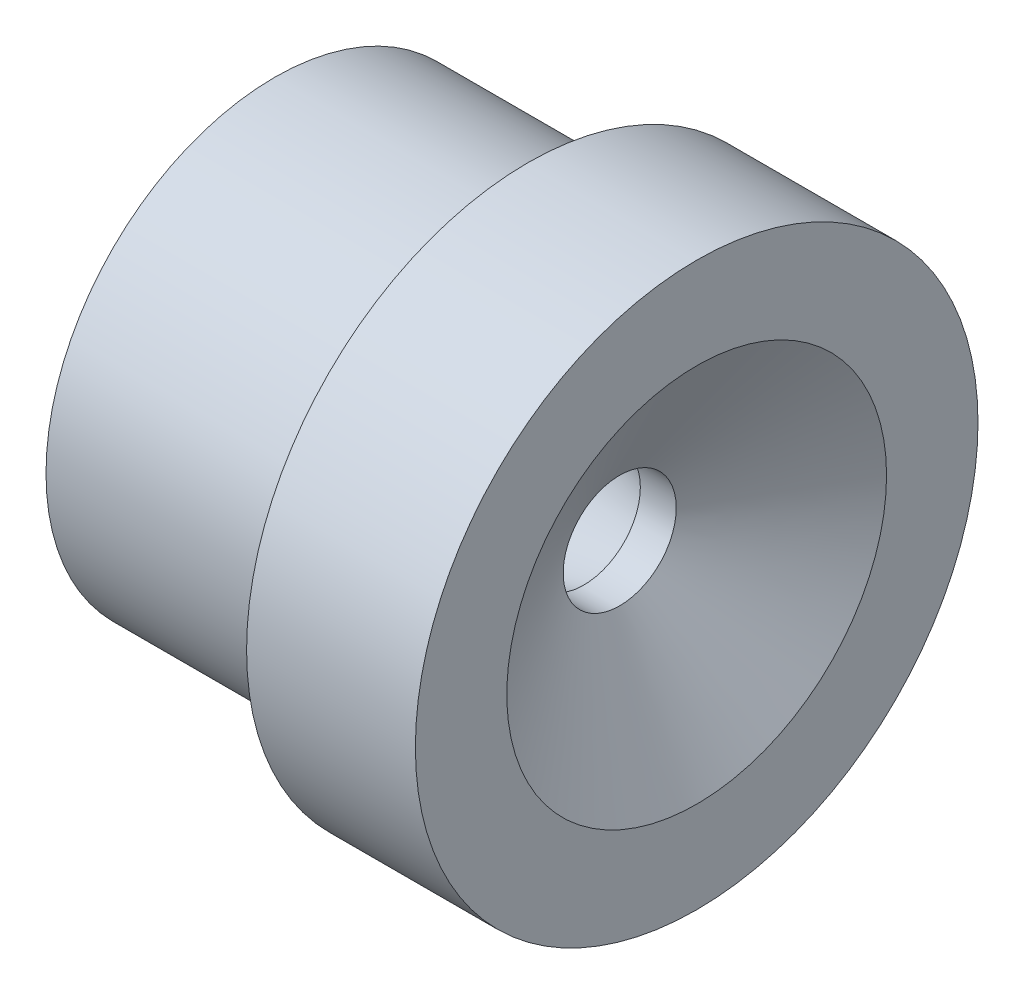
ISO-10303-21;
HEADER;
FILE_DESCRIPTION(('STEP AP214'),'2;1');
FILE_NAME('part.step','',(''),(''),'','','');
FILE_SCHEMA(('AUTOMOTIVE_DESIGN { 1 0 10303 214 1 1 1 1 }'));
ENDSEC;
DATA;
#1=APPLICATION_CONTEXT('core data for automotive mechanical design processes');
#2=APPLICATION_PROTOCOL_DEFINITION('international standard','automotive_design',2000,#1);
#3=PRODUCT_CONTEXT('',#1,'mechanical');
#4=PRODUCT('Part','Part','',(#3));
#5=PRODUCT_RELATED_PRODUCT_CATEGORY('part','',(#4));
#6=PRODUCT_DEFINITION_FORMATION('','',#4);
#7=PRODUCT_DEFINITION_CONTEXT('part definition',#1,'design');
#8=PRODUCT_DEFINITION('design','',#6,#7);
#9=PRODUCT_DEFINITION_SHAPE('','',#8);
#10=(LENGTH_UNIT() NAMED_UNIT(*) SI_UNIT(.MILLI.,.METRE.));
#11=(NAMED_UNIT(*) PLANE_ANGLE_UNIT() SI_UNIT($,.RADIAN.));
#12=(NAMED_UNIT(*) SI_UNIT($,.STERADIAN.) SOLID_ANGLE_UNIT());
#13=UNCERTAINTY_MEASURE_WITH_UNIT(LENGTH_MEASURE(1.E-05),#10,'distance_accuracy_value','');
#14=(GEOMETRIC_REPRESENTATION_CONTEXT(3) GLOBAL_UNCERTAINTY_ASSIGNED_CONTEXT((#13)) GLOBAL_UNIT_ASSIGNED_CONTEXT((#10,
#11,#12)) REPRESENTATION_CONTEXT('',''));
#15=CARTESIAN_POINT('',(0.,0.,0.));
#16=DIRECTION('',(0.,0.,1.));
#17=DIRECTION('',(1.,0.,0.));
#18=AXIS2_PLACEMENT_3D('',#15,#16,#17);
#19=CARTESIAN_POINT('',(5.11872970120267,0.,-12.7));
#20=DIRECTION('',(1.,0.,0.));
#21=DIRECTION('',(0.,0.,-1.));
#22=AXIS2_PLACEMENT_3D('',#19,#20,#21);
#23=CYLINDRICAL_SURFACE('',#22,12.7);
#24=CARTESIAN_POINT('',(0.,0.,-12.7));
#25=DIRECTION('',(1.,0.,0.));
#26=DIRECTION('',(0.,0.,-1.));
#27=AXIS2_PLACEMENT_3D('',#24,#25,#26);
#28=CIRCLE('',#27,12.7);
#29=CARTESIAN_POINT('',(0.,0.,-25.4));
#30=VERTEX_POINT('',#29);
#31=EDGE_CURVE('E10',#30,#30,#28,.T.);
#32=ORIENTED_EDGE('',*,*,#31,.F.);
#33=EDGE_LOOP('',(#32));
#34=FACE_BOUND('',#33,.T.);
#35=CARTESIAN_POINT('',(-7.62,0.,-12.7));
#36=DIRECTION('',(1.,0.,0.));
#37=DIRECTION('',(0.,0.,-1.));
#38=AXIS2_PLACEMENT_3D('',#35,#36,#37);
#39=CIRCLE('',#38,12.7);
#40=CARTESIAN_POINT('',(-7.62000000000001,0.,-25.4));
#41=VERTEX_POINT('',#40);
#42=EDGE_CURVE('E68',#41,#41,#39,.T.);
#43=ORIENTED_EDGE('',*,*,#42,.T.);
#44=EDGE_LOOP('',(#43));
#45=FACE_BOUND('',#44,.T.);
#46=ADVANCED_FACE('F36',(#34,#45),#23,.T.);
#47=CARTESIAN_POINT('',(0.,0.,0.));
#48=DIRECTION('',(-1.,0.,0.));
#49=DIRECTION('',(0.,0.,1.));
#50=AXIS2_PLACEMENT_3D('',#47,#48,#49);
#51=PLANE('',#50);
#52=CARTESIAN_POINT('',(0.,0.,-12.7));
#53=DIRECTION('',(1.,0.,0.));
#54=DIRECTION('',(0.,0.,-1.));
#55=AXIS2_PLACEMENT_3D('',#52,#53,#54);
#56=CIRCLE('',#55,8.5725);
#57=CARTESIAN_POINT('',(0.,0.,-21.2725));
#58=VERTEX_POINT('',#57);
#59=EDGE_CURVE('E42',#58,#58,#56,.T.);
#60=ORIENTED_EDGE('',*,*,#59,.F.);
#61=EDGE_LOOP('',(#60));
#62=FACE_BOUND('',#61,.T.);
#63=ORIENTED_EDGE('',*,*,#31,.T.);
#64=EDGE_LOOP('',(#63));
#65=FACE_BOUND('',#64,.T.);
#66=ADVANCED_FACE('F103',(#62,#65),#51,.F.);
#67=CARTESIAN_POINT('',(0.,0.,-12.7));
#68=DIRECTION('',(1.,0.,0.));
#69=DIRECTION('',(0.,0.,-1.));
#70=AXIS2_PLACEMENT_3D('',#67,#68,#69);
#71=CONICAL_SURFACE('',#70,8.5725,1.0471975511966);
#72=CARTESIAN_POINT('',(-3.47553315046769,0.,-12.7));
#73=DIRECTION('',(1.,0.,0.));
#74=DIRECTION('',(0.,0.,-1.));
#75=AXIS2_PLACEMENT_3D('',#72,#73,#74);
#76=CIRCLE('',#75,2.5527);
#77=CARTESIAN_POINT('',(-3.47553315046769,0.,-15.2527));
#78=VERTEX_POINT('',#77);
#79=EDGE_CURVE('E48',#78,#78,#76,.T.);
#80=CARTESIAN_POINT('',(-3.47553315046769,0.,-15.2527));
#81=CARTESIAN_POINT('',(-3.43932968015032,0.,-15.31540625));
#82=CARTESIAN_POINT('',(-3.40312620983295,0.,-15.3781125));
#83=CARTESIAN_POINT('',(-3.33071926919821,0.,-15.503525));
#84=CARTESIAN_POINT('',(-3.29451579888083,0.,-15.56623125));
#85=CARTESIAN_POINT('',(-3.22210885824609,0.,-15.69164375));
#86=CARTESIAN_POINT('',(-3.18590538792872,0.,-15.75435));
#87=CARTESIAN_POINT('',(-3.11349844729398,0.,-15.8797625));
#88=CARTESIAN_POINT('',(-3.0772949769766,0.,-15.94246875));
#89=CARTESIAN_POINT('',(-3.00488803634186,0.,-16.06788125));
#90=CARTESIAN_POINT('',(-2.96868456602449,0.,-16.1305875));
#91=CARTESIAN_POINT('',(-2.89627762538975,0.,-16.256));
#92=CARTESIAN_POINT('',(-2.86007415507237,0.,-16.31870625));
#93=CARTESIAN_POINT('',(-2.78766721443763,0.,-16.44411875));
#94=CARTESIAN_POINT('',(-2.75146374412026,0.,-16.506825));
#95=CARTESIAN_POINT('',(-2.67905680348552,0.,-16.6322375));
#96=CARTESIAN_POINT('',(-2.64285333316814,0.,-16.69494375));
#97=CARTESIAN_POINT('',(-2.5704463925334,0.,-16.82035625));
#98=CARTESIAN_POINT('',(-2.53424292221603,0.,-16.8830625));
#99=CARTESIAN_POINT('',(-2.46183598158128,0.,-17.008475));
#100=CARTESIAN_POINT('',(-2.42563251126391,0.,-17.07118125));
#101=CARTESIAN_POINT('',(-2.35322557062917,0.,-17.19659375));
#102=CARTESIAN_POINT('',(-2.3170221003118,0.,-17.2593));
#103=CARTESIAN_POINT('',(-2.24461515967705,0.,-17.3847125));
#104=CARTESIAN_POINT('',(-2.20841168935968,0.,-17.44741875));
#105=CARTESIAN_POINT('',(-2.13600474872494,0.,-17.57283125));
#106=CARTESIAN_POINT('',(-2.09980127840757,0.,-17.6355375));
#107=CARTESIAN_POINT('',(-2.02739433777282,0.,-17.76095));
#108=CARTESIAN_POINT('',(-1.99119086745545,0.,-17.82365625));
#109=CARTESIAN_POINT('',(-1.91878392682071,0.,-17.94906875));
#110=CARTESIAN_POINT('',(-1.88258045650334,0.,-18.011775));
#111=CARTESIAN_POINT('',(-1.81017351586859,0.,-18.1371875));
#112=CARTESIAN_POINT('',(-1.77397004555122,0.,-18.19989375));
#113=CARTESIAN_POINT('',(-1.70156310491648,0.,-18.32530625));
#114=CARTESIAN_POINT('',(-1.66535963459911,0.,-18.3880125));
#115=CARTESIAN_POINT('',(-1.59295269396436,0.,-18.513425));
#116=CARTESIAN_POINT('',(-1.55674922364699,0.,-18.57613125));
#117=CARTESIAN_POINT('',(-1.48434228301225,0.,-18.70154375));
#118=CARTESIAN_POINT('',(-1.44813881269488,0.,-18.76425));
#119=CARTESIAN_POINT('',(-1.37573187206013,0.,-18.8896625));
#120=CARTESIAN_POINT('',(-1.33952840174276,0.,-18.95236875));
#121=CARTESIAN_POINT('',(-1.26712146110802,0.,-19.07778125));
#122=CARTESIAN_POINT('',(-1.23091799079064,0.,-19.1404875));
#123=CARTESIAN_POINT('',(-1.1585110501559,0.,-19.2659));
#124=CARTESIAN_POINT('',(-1.12230757983853,0.,-19.32860625));
#125=CARTESIAN_POINT('',(-1.04990063920379,0.,-19.45401875));
#126=CARTESIAN_POINT('',(-1.01369716888641,0.,-19.516725));
#127=CARTESIAN_POINT('',(-0.941290228251671,0.,-19.6421375));
#128=CARTESIAN_POINT('',(-0.905086757934299,0.,-19.70484375));
#129=CARTESIAN_POINT('',(-0.832679817299556,0.,-19.83025625));
#130=CARTESIAN_POINT('',(-0.796476346982184,0.,-19.8929625));
#131=CARTESIAN_POINT('',(-0.72406940634744,0.,-20.018375));
#132=CARTESIAN_POINT('',(-0.687865936030068,0.,-20.08108125));
#133=CARTESIAN_POINT('',(-0.615458995395325,0.,-20.20649375));
#134=CARTESIAN_POINT('',(-0.579255525077954,0.,-20.2692));
#135=CARTESIAN_POINT('',(-0.50684858444321,0.,-20.3946125));
#136=CARTESIAN_POINT('',(-0.470645114125838,0.,-20.45731875));
#137=CARTESIAN_POINT('',(-0.398238173491094,0.,-20.58273125));
#138=CARTESIAN_POINT('',(-0.362034703173723,0.,-20.6454375));
#139=CARTESIAN_POINT('',(-0.289627762538979,0.,-20.77085));
#140=CARTESIAN_POINT('',(-0.253424292221608,0.,-20.83355625));
#141=CARTESIAN_POINT('',(-0.181017351586864,0.,-20.95896875));
#142=CARTESIAN_POINT('',(-0.144813881269493,0.,-21.021675));
#143=CARTESIAN_POINT('',(-0.0724069406347491,0.,-21.1470875));
#144=CARTESIAN_POINT('',(-0.0362034703173773,0.,-21.20979375));
#145=CARTESIAN_POINT('',(0.,0.,-21.2725));
#146=B_SPLINE_CURVE_WITH_KNOTS('',3,(#80,#81,#82,#83,#84,#85,#86,#87,#88,#89,#90,#91,#92,#93,
#94,#95,#96,#97,#98,#99,#100,#101,#102,#103,#104,#105,#106,#107,#108,#109,#110,#111,#112,#113,
#114,#115,#116,#117,#118,#119,#120,#121,#122,#123,#124,#125,#126,#127,#128,#129,#130,#131,#132,
#133,#134,#135,#136,#137,#138,#139,#140,#141,#142,#143,#144,#145),.UNSPECIFIED.,.F.,.F.,(4,2,2,
2,2,2,2,2,2,2,2,2,2,2,2,2,2,2,2,2,2,2,2,2,2,2,2,2,2,2,2,2,4),(0.,0.217220821904232,
0.434441643808466,0.651662465712695,0.868883287616927,1.08610410952116,1.30332493142539,
1.52054575332962,1.73776657523385,1.95498739713809,2.17220821904232,2.38942904094655,
2.60664986285078,2.82387068475501,3.04109150665924,3.25831232856347,3.4755331504677,
3.69275397237194,3.90997479427617,4.1271956161804,4.34441643808463,4.56163725998886,
4.7788580818931,4.99607890379733,5.21329972570156,5.43052054760579,5.64774136951002,
5.86496219141425,6.08218301331848,6.29940383522271,6.51662465712695,6.73384547903118,
6.95106630093541),.UNSPECIFIED.);
#147=EDGE_CURVE('BSEAM98',#78,#58,#146,.T.);
#148=ORIENTED_EDGE('',*,*,#79,.F.);
#149=ORIENTED_EDGE('',*,*,#59,.T.);
#150=ORIENTED_EDGE('',*,*,#147,.T.);
#151=ORIENTED_EDGE('',*,*,#147,.F.);
#152=EDGE_LOOP('',(#148,#150,#149,#151));
#153=FACE_BOUND('',#152,.T.);
#154=ADVANCED_FACE('F98',(#153),#71,.F.);
#155=CARTESIAN_POINT('',(5.11872970120267,0.,-12.7));
#156=DIRECTION('',(1.,0.,0.));
#157=DIRECTION('',(0.,0.,-1.));
#158=AXIS2_PLACEMENT_3D('',#155,#156,#157);
#159=CYLINDRICAL_SURFACE('',#158,2.5527);
#160=CARTESIAN_POINT('',(-5.09605315046769,0.,-12.7));
#161=DIRECTION('',(1.,0.,0.));
#162=DIRECTION('',(0.,0.,-1.));
#163=AXIS2_PLACEMENT_3D('',#160,#161,#162);
#164=CIRCLE('',#163,2.5527);
#165=CARTESIAN_POINT('',(-5.09605315046769,0.,-15.2527));
#166=VERTEX_POINT('',#165);
#167=EDGE_CURVE('E55',#166,#166,#164,.T.);
#168=ORIENTED_EDGE('',*,*,#167,.F.);
#169=EDGE_LOOP('',(#168));
#170=FACE_BOUND('',#169,.T.);
#171=ORIENTED_EDGE('',*,*,#79,.T.);
#172=EDGE_LOOP('',(#171));
#173=FACE_BOUND('',#172,.T.);
#174=ADVANCED_FACE('F95',(#170,#173),#159,.F.);
#175=CARTESIAN_POINT('',(-5.09605315046769,0.,-12.7));
#176=DIRECTION('',(-1.,0.,0.));
#177=DIRECTION('',(0.,0.,1.));
#178=AXIS2_PLACEMENT_3D('',#175,#176,#177);
#179=CONICAL_SURFACE('',#178,2.5527,0.26179938779915);
#180=CARTESIAN_POINT('',(-19.05,0.,-12.7));
#181=DIRECTION('',(1.,0.,0.));
#182=DIRECTION('',(0.,0.,-1.));
#183=AXIS2_PLACEMENT_3D('',#180,#181,#182);
#184=CIRCLE('',#183,6.291648789559);
#185=CARTESIAN_POINT('',(-19.05,0.,-18.991648789559));
#186=VERTEX_POINT('',#185);
#187=EDGE_CURVE('E60',#186,#186,#184,.T.);
#188=ORIENTED_EDGE('',*,*,#187,.F.);
#189=EDGE_LOOP('',(#188));
#190=FACE_BOUND('',#189,.T.);
#191=ORIENTED_EDGE('',*,*,#167,.T.);
#192=EDGE_LOOP('',(#191));
#193=FACE_BOUND('',#192,.T.);
#194=ADVANCED_FACE('F88',(#190,#193),#179,.F.);
#195=CARTESIAN_POINT('',(-19.05,0.,-6.408351210441));
#196=DIRECTION('',(1.,0.,0.));
#197=DIRECTION('',(0.,0.,-1.));
#198=AXIS2_PLACEMENT_3D('',#195,#196,#197);
#199=PLANE('',#198);
#200=CARTESIAN_POINT('',(-19.05,0.,-12.7));
#201=DIRECTION('',(1.,0.,0.));
#202=DIRECTION('',(0.,0.,-1.));
#203=AXIS2_PLACEMENT_3D('',#200,#201,#202);
#204=CIRCLE('',#203,10.3251);
#205=CARTESIAN_POINT('',(-19.05,0.,-23.0251));
#206=VERTEX_POINT('',#205);
#207=EDGE_CURVE('E58',#206,#206,#204,.T.);
#208=ORIENTED_EDGE('',*,*,#207,.F.);
#209=EDGE_LOOP('',(#208));
#210=FACE_BOUND('',#209,.T.);
#211=ORIENTED_EDGE('',*,*,#187,.T.);
#212=EDGE_LOOP('',(#211));
#213=FACE_BOUND('',#212,.T.);
#214=ADVANCED_FACE('F77',(#210,#213),#199,.F.);
#215=CARTESIAN_POINT('',(5.11872970120267,0.,-12.7));
#216=DIRECTION('',(1.,0.,0.));
#217=DIRECTION('',(0.,0.,-1.));
#218=AXIS2_PLACEMENT_3D('',#215,#216,#217);
#219=CYLINDRICAL_SURFACE('',#218,10.3251);
#220=CARTESIAN_POINT('',(-7.62,0.,-12.7));
#221=DIRECTION('',(1.,0.,0.));
#222=DIRECTION('',(0.,0.,-1.));
#223=AXIS2_PLACEMENT_3D('',#220,#221,#222);
#224=CIRCLE('',#223,10.3251);
#225=CARTESIAN_POINT('',(-7.62,0.,-23.0251));
#226=VERTEX_POINT('',#225);
#227=EDGE_CURVE('E65',#226,#226,#224,.T.);
#228=ORIENTED_EDGE('',*,*,#227,.F.);
#229=EDGE_LOOP('',(#228));
#230=FACE_BOUND('',#229,.T.);
#231=ORIENTED_EDGE('',*,*,#207,.T.);
#232=EDGE_LOOP('',(#231));
#233=FACE_BOUND('',#232,.T.);
#234=ADVANCED_FACE('F74',(#230,#233),#219,.T.);
#235=CARTESIAN_POINT('',(-7.62,0.,-2.3749));
#236=DIRECTION('',(1.,0.,0.));
#237=DIRECTION('',(0.,0.,-1.));
#238=AXIS2_PLACEMENT_3D('',#235,#236,#237);
#239=PLANE('',#238);
#240=ORIENTED_EDGE('',*,*,#42,.F.);
#241=EDGE_LOOP('',(#240));
#242=FACE_BOUND('',#241,.T.);
#243=ORIENTED_EDGE('',*,*,#227,.T.);
#244=EDGE_LOOP('',(#243));
#245=FACE_BOUND('',#244,.T.);
#246=ADVANCED_FACE('F72',(#242,#245),#239,.F.);
#247=CLOSED_SHELL('',(#46,#66,#154,#174,#194,#214,#234,#246));
#248=MANIFOLD_SOLID_BREP('B2',#247);
#249=ADVANCED_BREP_SHAPE_REPRESENTATION('',(#18,#248),#14);
#250=SHAPE_DEFINITION_REPRESENTATION(#9,#249);
ENDSEC;
END-ISO-10303-21;
